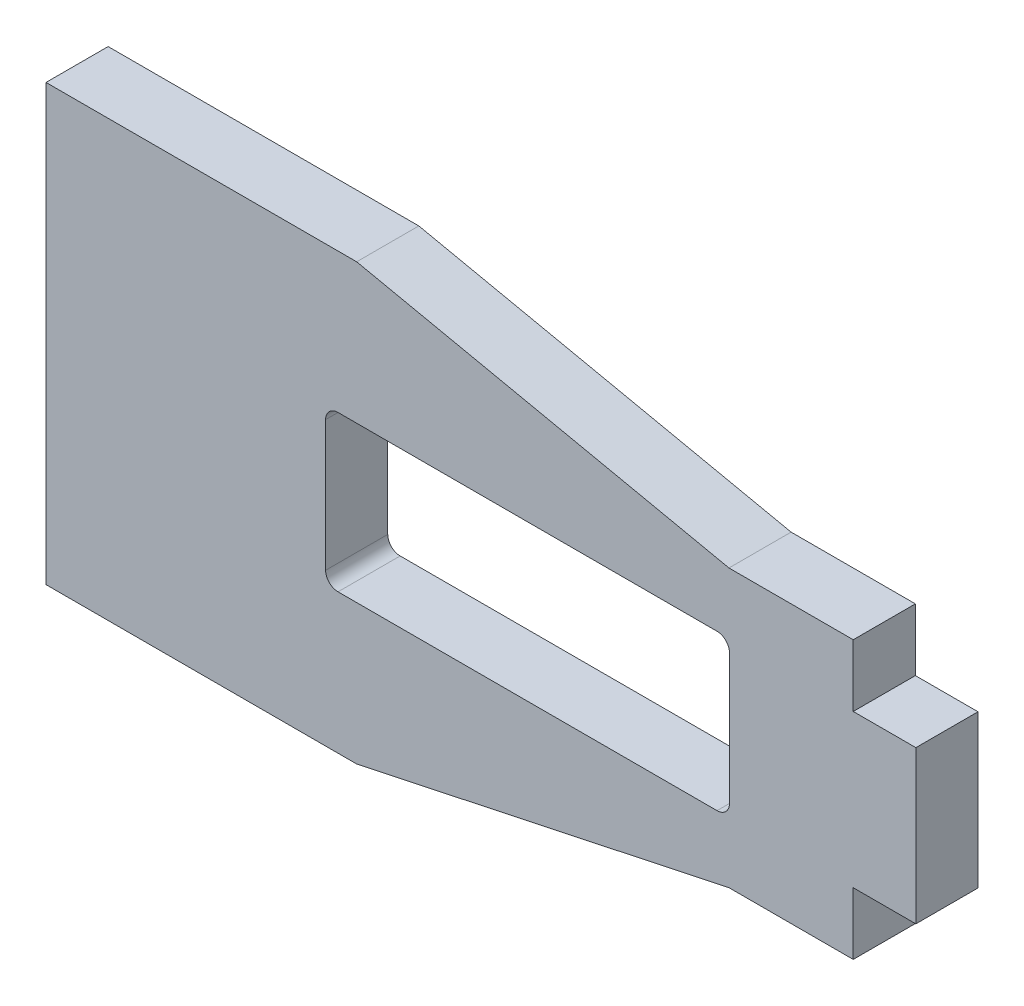
ISO-10303-21;
HEADER;
FILE_DESCRIPTION(('STEP AP214'),'2;1');
FILE_NAME('part.step','',(''),(''),'','','');
FILE_SCHEMA(('AUTOMOTIVE_DESIGN { 1 0 10303 214 1 1 1 1 }'));
ENDSEC;
DATA;
#1=APPLICATION_CONTEXT('core data for automotive mechanical design processes');
#2=APPLICATION_PROTOCOL_DEFINITION('international standard','automotive_design',2000,#1);
#3=PRODUCT_CONTEXT('',#1,'mechanical');
#4=PRODUCT('Part','Part','',(#3));
#5=PRODUCT_RELATED_PRODUCT_CATEGORY('part','',(#4));
#6=PRODUCT_DEFINITION_FORMATION('','',#4);
#7=PRODUCT_DEFINITION_CONTEXT('part definition',#1,'design');
#8=PRODUCT_DEFINITION('design','',#6,#7);
#9=PRODUCT_DEFINITION_SHAPE('','',#8);
#10=(LENGTH_UNIT() NAMED_UNIT(*) SI_UNIT(.MILLI.,.METRE.));
#11=(NAMED_UNIT(*) PLANE_ANGLE_UNIT() SI_UNIT($,.RADIAN.));
#12=(NAMED_UNIT(*) SI_UNIT($,.STERADIAN.) SOLID_ANGLE_UNIT());
#13=UNCERTAINTY_MEASURE_WITH_UNIT(LENGTH_MEASURE(1.E-05),#10,'distance_accuracy_value','');
#14=(GEOMETRIC_REPRESENTATION_CONTEXT(3) GLOBAL_UNCERTAINTY_ASSIGNED_CONTEXT((#13)) GLOBAL_UNIT_ASSIGNED_CONTEXT((#10,
#11,#12)) REPRESENTATION_CONTEXT('',''));
#15=CARTESIAN_POINT('',(0.,0.,0.));
#16=DIRECTION('',(0.,0.,1.));
#17=DIRECTION('',(1.,0.,0.));
#18=AXIS2_PLACEMENT_3D('',#15,#16,#17);
#19=CARTESIAN_POINT('',(70.,35.,10.));
#20=DIRECTION('',(-1.,0.,0.));
#21=DIRECTION('',(0.,0.,1.));
#22=AXIS2_PLACEMENT_3D('',#19,#20,#21);
#23=PLANE('',#22);
#24=DIRECTION('',(0.,1.,0.));
#25=VECTOR('',#24,1.);
#26=CARTESIAN_POINT('',(70.,35.,10.));
#27=LINE('',#26,#25);
#28=CARTESIAN_POINT('',(70.,-12.2819598667104,10.));
#29=VERTEX_POINT('',#28);
#30=CARTESIAN_POINT('',(70.,12.2819598667104,10.));
#31=VERTEX_POINT('',#30);
#32=EDGE_CURVE('E350',#29,#31,#27,.T.);
#33=ORIENTED_EDGE('',*,*,#32,.F.);
#34=DIRECTION('',(0.,0.,1.));
#35=VECTOR('',#34,1.);
#36=CARTESIAN_POINT('',(70.,-12.2819598667104,0.));
#37=LINE('',#36,#35);
#38=CARTESIAN_POINT('',(70.,-12.2819598667104,0.));
#39=VERTEX_POINT('',#38);
#40=EDGE_CURVE('E390',#39,#29,#37,.T.);
#41=ORIENTED_EDGE('',*,*,#40,.F.);
#42=DIRECTION('',(0.,1.,0.));
#43=VECTOR('',#42,1.);
#44=CARTESIAN_POINT('',(70.,35.,0.));
#45=LINE('',#44,#43);
#46=CARTESIAN_POINT('',(70.,12.2819598667104,0.));
#47=VERTEX_POINT('',#46);
#48=EDGE_CURVE('E264',#39,#47,#45,.T.);
#49=ORIENTED_EDGE('',*,*,#48,.T.);
#50=DIRECTION('',(0.,0.,1.));
#51=VECTOR('',#50,1.);
#52=CARTESIAN_POINT('',(70.,12.2819598667104,0.));
#53=LINE('',#52,#51);
#54=EDGE_CURVE('E343',#47,#31,#53,.T.);
#55=ORIENTED_EDGE('',*,*,#54,.T.);
#56=EDGE_LOOP('',(#33,#41,#49,#55));
#57=FACE_BOUND('',#56,.T.);
#58=ADVANCED_FACE('F99',(#57),#23,.F.);
#59=CARTESIAN_POINT('',(0.,0.,10.));
#60=DIRECTION('',(0.,0.,1.));
#61=DIRECTION('',(1.,0.,0.));
#62=AXIS2_PLACEMENT_3D('',#59,#60,#61);
#63=PLANE('',#62);
#64=DIRECTION('',(-1.,0.,0.));
#65=VECTOR('',#64,1.);
#66=CARTESIAN_POINT('',(0.,-12.2819598667105,10.));
#67=LINE('',#66,#65);
#68=CARTESIAN_POINT('',(59.920279213357,-12.2819598667104,10.));
#69=VERTEX_POINT('',#68);
#70=EDGE_CURVE('E384',#29,#69,#67,.T.);
#71=ORIENTED_EDGE('',*,*,#70,.F.);
#72=ORIENTED_EDGE('',*,*,#32,.T.);
#73=DIRECTION('',(-1.,0.,0.));
#74=VECTOR('',#73,1.);
#75=CARTESIAN_POINT('',(0.,12.2819598667105,10.));
#76=LINE('',#75,#74);
#77=CARTESIAN_POINT('',(59.920279213357,12.2819598667104,10.));
#78=VERTEX_POINT('',#77);
#79=EDGE_CURVE('E247',#31,#78,#76,.T.);
#80=ORIENTED_EDGE('',*,*,#79,.T.);
#81=DIRECTION('',(0.,1.,0.));
#82=VECTOR('',#81,1.);
#83=CARTESIAN_POINT('',(59.920279213357,0.,10.));
#84=LINE('',#83,#82);
#85=CARTESIAN_POINT('',(59.920279213357,22.2819598667104,10.));
#86=VERTEX_POINT('',#85);
#87=EDGE_CURVE('E673',#78,#86,#84,.T.);
#88=ORIENTED_EDGE('',*,*,#87,.T.);
#89=DIRECTION('',(-1.,0.,0.));
#90=VECTOR('',#89,1.);
#91=CARTESIAN_POINT('',(0.,22.2819598667105,10.));
#92=LINE('',#91,#90);
#93=CARTESIAN_POINT('',(39.920279213357,22.2819598667104,10.));
#94=VERTEX_POINT('',#93);
#95=EDGE_CURVE('E684',#86,#94,#92,.T.);
#96=ORIENTED_EDGE('',*,*,#95,.T.);
#97=DIRECTION('',(0.978208674738942,-0.207624152413639,0.));
#98=VECTOR('',#97,1.);
#99=CARTESIAN_POINT('',(6.24633537086233,29.4292324571813,10.));
#100=LINE('',#99,#98);
#101=CARTESIAN_POINT('',(-20.,35.,10.));
#102=VERTEX_POINT('',#101);
#103=EDGE_CURVE('E389',#102,#94,#100,.T.);
#104=ORIENTED_EDGE('',*,*,#103,.F.);
#105=DIRECTION('',(-1.,0.,0.));
#106=VECTOR('',#105,1.);
#107=CARTESIAN_POINT('',(-70.,35.,10.));
#108=LINE('',#107,#106);
#109=CARTESIAN_POINT('',(-70.,35.,10.));
#110=VERTEX_POINT('',#109);
#111=EDGE_CURVE('E255',#102,#110,#108,.T.);
#112=ORIENTED_EDGE('',*,*,#111,.T.);
#113=DIRECTION('',(0.,-1.,0.));
#114=VECTOR('',#113,1.);
#115=CARTESIAN_POINT('',(-70.,35.,10.));
#116=LINE('',#115,#114);
#117=CARTESIAN_POINT('',(-70.,-35.,10.));
#118=VERTEX_POINT('',#117);
#119=EDGE_CURVE('E263',#110,#118,#116,.T.);
#120=ORIENTED_EDGE('',*,*,#119,.T.);
#121=DIRECTION('',(1.,0.,0.));
#122=VECTOR('',#121,1.);
#123=CARTESIAN_POINT('',(-70.,-35.,10.));
#124=LINE('',#123,#122);
#125=CARTESIAN_POINT('',(-20.,-35.,10.));
#126=VERTEX_POINT('',#125);
#127=EDGE_CURVE('E267',#118,#126,#124,.T.);
#128=ORIENTED_EDGE('',*,*,#127,.T.);
#129=DIRECTION('',(-0.978208674738942,-0.207624152413639,0.));
#130=VECTOR('',#129,1.);
#131=CARTESIAN_POINT('',(6.24633537086233,-29.4292324571813,10.));
#132=LINE('',#131,#130);
#133=CARTESIAN_POINT('',(39.920279213357,-22.2819598667104,10.));
#134=VERTEX_POINT('',#133);
#135=EDGE_CURVE('E382',#134,#126,#132,.T.);
#136=ORIENTED_EDGE('',*,*,#135,.F.);
#137=DIRECTION('',(-1.,0.,0.));
#138=VECTOR('',#137,1.);
#139=CARTESIAN_POINT('',(0.,-22.2819598667105,10.));
#140=LINE('',#139,#138);
#141=CARTESIAN_POINT('',(59.920279213357,-22.2819598667104,10.));
#142=VERTEX_POINT('',#141);
#143=EDGE_CURVE('E379',#142,#134,#140,.T.);
#144=ORIENTED_EDGE('',*,*,#143,.F.);
#145=DIRECTION('',(0.,-1.,0.));
#146=VECTOR('',#145,1.);
#147=CARTESIAN_POINT('',(59.920279213357,0.,10.));
#148=LINE('',#147,#146);
#149=EDGE_CURVE('E376',#69,#142,#148,.T.);
#150=ORIENTED_EDGE('',*,*,#149,.F.);
#151=EDGE_LOOP('',(#71,#72,#80,#88,#96,#104,#112,#120,#128,#136,#144,#150));
#152=FACE_BOUND('',#151,.T.);
#153=DIRECTION('',(1.,0.,0.));
#154=VECTOR('',#153,1.);
#155=CARTESIAN_POINT('',(0.,-12.5,10.));
#156=LINE('',#155,#154);
#157=CARTESIAN_POINT('',(-23.,-12.5,10.));
#158=VERTEX_POINT('',#157);
#159=CARTESIAN_POINT('',(38.,-12.5,10.));
#160=VERTEX_POINT('',#159);
#161=EDGE_CURVE('E315',#158,#160,#156,.T.);
#162=ORIENTED_EDGE('',*,*,#161,.F.);
#163=CARTESIAN_POINT('',(-23.,-10.5,10.));
#164=DIRECTION('',(0.,0.,1.));
#165=DIRECTION('',(1.,0.,0.));
#166=AXIS2_PLACEMENT_3D('',#163,#164,#165);
#167=CIRCLE('',#166,2.);
#168=CARTESIAN_POINT('',(-25.,-10.5,10.));
#169=VERTEX_POINT('',#168);
#170=EDGE_CURVE('E107',#158,#169,#167,.F.);
#171=ORIENTED_EDGE('',*,*,#170,.T.);
#172=DIRECTION('',(0.,-1.,0.));
#173=VECTOR('',#172,1.);
#174=CARTESIAN_POINT('',(-25.,0.,10.));
#175=LINE('',#174,#173);
#176=CARTESIAN_POINT('',(-25.,10.5,10.));
#177=VERTEX_POINT('',#176);
#178=EDGE_CURVE('E314',#177,#169,#175,.T.);
#179=ORIENTED_EDGE('',*,*,#178,.F.);
#180=CARTESIAN_POINT('',(-23.,10.5,10.));
#181=DIRECTION('',(0.,0.,1.));
#182=DIRECTION('',(1.,0.,0.));
#183=AXIS2_PLACEMENT_3D('',#180,#181,#182);
#184=CIRCLE('',#183,2.);
#185=CARTESIAN_POINT('',(-23.,12.5,10.));
#186=VERTEX_POINT('',#185);
#187=EDGE_CURVE('E298',#177,#186,#184,.F.);
#188=ORIENTED_EDGE('',*,*,#187,.T.);
#189=DIRECTION('',(1.,0.,0.));
#190=VECTOR('',#189,1.);
#191=CARTESIAN_POINT('',(0.,12.5,10.));
#192=LINE('',#191,#190);
#193=CARTESIAN_POINT('',(38.,12.5,10.));
#194=VERTEX_POINT('',#193);
#195=EDGE_CURVE('E324',#186,#194,#192,.T.);
#196=ORIENTED_EDGE('',*,*,#195,.T.);
#197=CARTESIAN_POINT('',(38.,10.5,10.));
#198=DIRECTION('',(0.,0.,1.));
#199=DIRECTION('',(1.,0.,0.));
#200=AXIS2_PLACEMENT_3D('',#197,#198,#199);
#201=CIRCLE('',#200,2.);
#202=CARTESIAN_POINT('',(40.,10.5,10.));
#203=VERTEX_POINT('',#202);
#204=EDGE_CURVE('E302',#194,#203,#201,.F.);
#205=ORIENTED_EDGE('',*,*,#204,.T.);
#206=DIRECTION('',(0.,-1.,0.));
#207=VECTOR('',#206,1.);
#208=CARTESIAN_POINT('',(40.,0.,10.));
#209=LINE('',#208,#207);
#210=CARTESIAN_POINT('',(40.,-10.5,10.));
#211=VERTEX_POINT('',#210);
#212=EDGE_CURVE('E342',#203,#211,#209,.T.);
#213=ORIENTED_EDGE('',*,*,#212,.T.);
#214=CARTESIAN_POINT('',(38.,-10.5,10.));
#215=DIRECTION('',(0.,0.,1.));
#216=DIRECTION('',(1.,0.,0.));
#217=AXIS2_PLACEMENT_3D('',#214,#215,#216);
#218=CIRCLE('',#217,2.);
#219=EDGE_CURVE('E306',#211,#160,#218,.F.);
#220=ORIENTED_EDGE('',*,*,#219,.T.);
#221=EDGE_LOOP('',(#162,#171,#179,#188,#196,#205,#213,#220));
#222=FACE_BOUND('',#221,.T.);
#223=ADVANCED_FACE('F313',(#152,#222),#63,.T.);
#224=CARTESIAN_POINT('',(0.,0.,0.));
#225=DIRECTION('',(0.,0.,1.));
#226=DIRECTION('',(1.,0.,0.));
#227=AXIS2_PLACEMENT_3D('',#224,#225,#226);
#228=PLANE('',#227);
#229=ORIENTED_EDGE('',*,*,#48,.F.);
#230=DIRECTION('',(-1.,0.,0.));
#231=VECTOR('',#230,1.);
#232=CARTESIAN_POINT('',(0.,-12.2819598667105,0.));
#233=LINE('',#232,#231);
#234=CARTESIAN_POINT('',(59.920279213357,-12.2819598667104,0.));
#235=VERTEX_POINT('',#234);
#236=EDGE_CURVE('E368',#39,#235,#233,.T.);
#237=ORIENTED_EDGE('',*,*,#236,.T.);
#238=DIRECTION('',(0.,-1.,0.));
#239=VECTOR('',#238,1.);
#240=CARTESIAN_POINT('',(59.920279213357,0.,0.));
#241=LINE('',#240,#239);
#242=CARTESIAN_POINT('',(59.920279213357,-22.2819598667104,0.));
#243=VERTEX_POINT('',#242);
#244=EDGE_CURVE('E372',#235,#243,#241,.T.);
#245=ORIENTED_EDGE('',*,*,#244,.T.);
#246=DIRECTION('',(-1.,0.,0.));
#247=VECTOR('',#246,1.);
#248=CARTESIAN_POINT('',(0.,-22.2819598667105,0.));
#249=LINE('',#248,#247);
#250=CARTESIAN_POINT('',(39.920279213357,-22.2819598667104,0.));
#251=VERTEX_POINT('',#250);
#252=EDGE_CURVE('E365',#243,#251,#249,.T.);
#253=ORIENTED_EDGE('',*,*,#252,.T.);
#254=DIRECTION('',(-0.978208674738942,-0.207624152413639,0.));
#255=VECTOR('',#254,1.);
#256=CARTESIAN_POINT('',(6.24633537086233,-29.4292324571813,0.));
#257=LINE('',#256,#255);
#258=CARTESIAN_POINT('',(-20.,-35.,0.));
#259=VERTEX_POINT('',#258);
#260=EDGE_CURVE('E362',#251,#259,#257,.T.);
#261=ORIENTED_EDGE('',*,*,#260,.T.);
#262=DIRECTION('',(1.,0.,0.));
#263=VECTOR('',#262,1.);
#264=CARTESIAN_POINT('',(-70.,-35.,0.));
#265=LINE('',#264,#263);
#266=CARTESIAN_POINT('',(-70.,-35.,0.));
#267=VERTEX_POINT('',#266);
#268=EDGE_CURVE('E270',#267,#259,#265,.T.);
#269=ORIENTED_EDGE('',*,*,#268,.F.);
#270=DIRECTION('',(0.,-1.,0.));
#271=VECTOR('',#270,1.);
#272=CARTESIAN_POINT('',(-70.,35.,0.));
#273=LINE('',#272,#271);
#274=CARTESIAN_POINT('',(-70.,35.,0.));
#275=VERTEX_POINT('',#274);
#276=EDGE_CURVE('E262',#275,#267,#273,.T.);
#277=ORIENTED_EDGE('',*,*,#276,.F.);
#278=DIRECTION('',(-1.,0.,0.));
#279=VECTOR('',#278,1.);
#280=CARTESIAN_POINT('',(-70.,35.,0.));
#281=LINE('',#280,#279);
#282=CARTESIAN_POINT('',(-20.,35.,0.));
#283=VERTEX_POINT('',#282);
#284=EDGE_CURVE('E253',#283,#275,#281,.T.);
#285=ORIENTED_EDGE('',*,*,#284,.F.);
#286=DIRECTION('',(0.978208674738942,-0.207624152413639,0.));
#287=VECTOR('',#286,1.);
#288=CARTESIAN_POINT('',(6.24633537086233,29.4292324571813,0.));
#289=LINE('',#288,#287);
#290=CARTESIAN_POINT('',(39.920279213357,22.2819598667104,0.));
#291=VERTEX_POINT('',#290);
#292=EDGE_CURVE('E235',#283,#291,#289,.T.);
#293=ORIENTED_EDGE('',*,*,#292,.T.);
#294=DIRECTION('',(-1.,0.,0.));
#295=VECTOR('',#294,1.);
#296=CARTESIAN_POINT('',(0.,22.2819598667105,0.));
#297=LINE('',#296,#295);
#298=CARTESIAN_POINT('',(59.920279213357,22.2819598667104,0.));
#299=VERTEX_POINT('',#298);
#300=EDGE_CURVE('E246',#299,#291,#297,.T.);
#301=ORIENTED_EDGE('',*,*,#300,.F.);
#302=DIRECTION('',(0.,1.,0.));
#303=VECTOR('',#302,1.);
#304=CARTESIAN_POINT('',(59.920279213357,0.,0.));
#305=LINE('',#304,#303);
#306=CARTESIAN_POINT('',(59.920279213357,12.2819598667104,0.));
#307=VERTEX_POINT('',#306);
#308=EDGE_CURVE('E678',#307,#299,#305,.T.);
#309=ORIENTED_EDGE('',*,*,#308,.F.);
#310=DIRECTION('',(-1.,0.,0.));
#311=VECTOR('',#310,1.);
#312=CARTESIAN_POINT('',(0.,12.2819598667105,0.));
#313=LINE('',#312,#311);
#314=EDGE_CURVE('E256',#47,#307,#313,.T.);
#315=ORIENTED_EDGE('',*,*,#314,.F.);
#316=EDGE_LOOP('',(#229,#237,#245,#253,#261,#269,#277,#285,#293,#301,#309,#315));
#317=FACE_BOUND('',#316,.T.);
#318=DIRECTION('',(1.,0.,0.));
#319=VECTOR('',#318,1.);
#320=CARTESIAN_POINT('',(0.,12.5,0.));
#321=LINE('',#320,#319);
#322=CARTESIAN_POINT('',(-23.,12.5,0.));
#323=VERTEX_POINT('',#322);
#324=CARTESIAN_POINT('',(38.,12.5,0.));
#325=VERTEX_POINT('',#324);
#326=EDGE_CURVE('E331',#323,#325,#321,.T.);
#327=ORIENTED_EDGE('',*,*,#326,.F.);
#328=CARTESIAN_POINT('',(-23.,10.5,0.));
#329=DIRECTION('',(0.,0.,1.));
#330=DIRECTION('',(1.,0.,0.));
#331=AXIS2_PLACEMENT_3D('',#328,#329,#330);
#332=CIRCLE('',#331,2.);
#333=CARTESIAN_POINT('',(-25.,10.5,0.));
#334=VERTEX_POINT('',#333);
#335=EDGE_CURVE('E300',#323,#334,#332,.T.);
#336=ORIENTED_EDGE('',*,*,#335,.T.);
#337=DIRECTION('',(0.,-1.,0.));
#338=VECTOR('',#337,1.);
#339=CARTESIAN_POINT('',(-25.,0.,0.));
#340=LINE('',#339,#338);
#341=CARTESIAN_POINT('',(-25.,-10.5,0.));
#342=VERTEX_POINT('',#341);
#343=EDGE_CURVE('E339',#334,#342,#340,.T.);
#344=ORIENTED_EDGE('',*,*,#343,.T.);
#345=CARTESIAN_POINT('',(-23.,-10.5,0.));
#346=DIRECTION('',(0.,0.,1.));
#347=DIRECTION('',(1.,0.,0.));
#348=AXIS2_PLACEMENT_3D('',#345,#346,#347);
#349=CIRCLE('',#348,2.);
#350=CARTESIAN_POINT('',(-23.,-12.5,0.));
#351=VERTEX_POINT('',#350);
#352=EDGE_CURVE('E12',#342,#351,#349,.T.);
#353=ORIENTED_EDGE('',*,*,#352,.T.);
#354=DIRECTION('',(1.,0.,0.));
#355=VECTOR('',#354,1.);
#356=CARTESIAN_POINT('',(0.,-12.5,0.));
#357=LINE('',#356,#355);
#358=CARTESIAN_POINT('',(38.,-12.5,0.));
#359=VERTEX_POINT('',#358);
#360=EDGE_CURVE('E323',#351,#359,#357,.T.);
#361=ORIENTED_EDGE('',*,*,#360,.T.);
#362=CARTESIAN_POINT('',(38.,-10.5,0.));
#363=DIRECTION('',(0.,0.,1.));
#364=DIRECTION('',(1.,0.,0.));
#365=AXIS2_PLACEMENT_3D('',#362,#363,#364);
#366=CIRCLE('',#365,2.);
#367=CARTESIAN_POINT('',(40.,-10.5,0.));
#368=VERTEX_POINT('',#367);
#369=EDGE_CURVE('E308',#359,#368,#366,.T.);
#370=ORIENTED_EDGE('',*,*,#369,.T.);
#371=DIRECTION('',(0.,-1.,0.));
#372=VECTOR('',#371,1.);
#373=CARTESIAN_POINT('',(40.,0.,0.));
#374=LINE('',#373,#372);
#375=CARTESIAN_POINT('',(40.,10.5,0.));
#376=VERTEX_POINT('',#375);
#377=EDGE_CURVE('E328',#376,#368,#374,.T.);
#378=ORIENTED_EDGE('',*,*,#377,.F.);
#379=CARTESIAN_POINT('',(38.,10.5,0.));
#380=DIRECTION('',(0.,0.,1.));
#381=DIRECTION('',(1.,0.,0.));
#382=AXIS2_PLACEMENT_3D('',#379,#380,#381);
#383=CIRCLE('',#382,2.);
#384=EDGE_CURVE('E304',#376,#325,#383,.T.);
#385=ORIENTED_EDGE('',*,*,#384,.T.);
#386=EDGE_LOOP('',(#327,#336,#344,#353,#361,#370,#378,#385));
#387=FACE_BOUND('',#386,.T.);
#388=ADVANCED_FACE('F260',(#317,#387),#228,.F.);
#389=CARTESIAN_POINT('',(-70.,35.,10.));
#390=DIRECTION('',(1.,0.,0.));
#391=DIRECTION('',(0.,0.,-1.));
#392=AXIS2_PLACEMENT_3D('',#389,#390,#391);
#393=PLANE('',#392);
#394=ORIENTED_EDGE('',*,*,#276,.T.);
#395=DIRECTION('',(0.,0.,-1.));
#396=VECTOR('',#395,1.);
#397=CARTESIAN_POINT('',(-70.,-35.,10.));
#398=LINE('',#397,#396);
#399=EDGE_CURVE('E276',#118,#267,#398,.T.);
#400=ORIENTED_EDGE('',*,*,#399,.F.);
#401=ORIENTED_EDGE('',*,*,#119,.F.);
#402=DIRECTION('',(0.,0.,-1.));
#403=VECTOR('',#402,1.);
#404=CARTESIAN_POINT('',(-70.,35.,10.));
#405=LINE('',#404,#403);
#406=EDGE_CURVE('E274',#110,#275,#405,.T.);
#407=ORIENTED_EDGE('',*,*,#406,.T.);
#408=EDGE_LOOP('',(#394,#400,#401,#407));
#409=FACE_BOUND('',#408,.T.);
#410=ADVANCED_FACE('F428',(#409),#393,.F.);
#411=CARTESIAN_POINT('',(-70.,-35.,10.));
#412=DIRECTION('',(0.,1.,0.));
#413=DIRECTION('',(0.,0.,1.));
#414=AXIS2_PLACEMENT_3D('',#411,#412,#413);
#415=PLANE('',#414);
#416=ORIENTED_EDGE('',*,*,#268,.T.);
#417=DIRECTION('',(0.,0.,1.));
#418=VECTOR('',#417,1.);
#419=CARTESIAN_POINT('',(-20.,-35.,0.));
#420=LINE('',#419,#418);
#421=EDGE_CURVE('E358',#259,#126,#420,.T.);
#422=ORIENTED_EDGE('',*,*,#421,.T.);
#423=ORIENTED_EDGE('',*,*,#127,.F.);
#424=ORIENTED_EDGE('',*,*,#399,.T.);
#425=EDGE_LOOP('',(#416,#422,#423,#424));
#426=FACE_BOUND('',#425,.T.);
#427=ADVANCED_FACE('F357',(#426),#415,.F.);
#428=CARTESIAN_POINT('',(-70.,35.,10.));
#429=DIRECTION('',(0.,-1.,0.));
#430=DIRECTION('',(0.,0.,-1.));
#431=AXIS2_PLACEMENT_3D('',#428,#429,#430);
#432=PLANE('',#431);
#433=ORIENTED_EDGE('',*,*,#111,.F.);
#434=DIRECTION('',(0.,0.,1.));
#435=VECTOR('',#434,1.);
#436=CARTESIAN_POINT('',(-20.,35.,0.));
#437=LINE('',#436,#435);
#438=EDGE_CURVE('E239',#283,#102,#437,.T.);
#439=ORIENTED_EDGE('',*,*,#438,.F.);
#440=ORIENTED_EDGE('',*,*,#284,.T.);
#441=ORIENTED_EDGE('',*,*,#406,.F.);
#442=EDGE_LOOP('',(#433,#439,#440,#441));
#443=FACE_BOUND('',#442,.T.);
#444=ADVANCED_FACE('F251',(#443),#432,.F.);
#445=CARTESIAN_POINT('',(0.,-12.5,0.));
#446=DIRECTION('',(0.,-1.,0.));
#447=DIRECTION('',(0.,0.,-1.));
#448=AXIS2_PLACEMENT_3D('',#445,#446,#447);
#449=PLANE('',#448);
#450=ORIENTED_EDGE('',*,*,#161,.T.);
#451=DIRECTION('',(0.,0.,1.));
#452=VECTOR('',#451,1.);
#453=CARTESIAN_POINT('',(38.,-12.5,0.));
#454=LINE('',#453,#452);
#455=EDGE_CURVE('E114',#160,#359,#454,.F.);
#456=ORIENTED_EDGE('',*,*,#455,.T.);
#457=ORIENTED_EDGE('',*,*,#360,.F.);
#458=DIRECTION('',(0.,0.,1.));
#459=VECTOR('',#458,1.);
#460=CARTESIAN_POINT('',(-23.,-12.5,10.));
#461=LINE('',#460,#459);
#462=EDGE_CURVE('E294',#351,#158,#461,.T.);
#463=ORIENTED_EDGE('',*,*,#462,.T.);
#464=EDGE_LOOP('',(#450,#456,#457,#463));
#465=FACE_BOUND('',#464,.T.);
#466=ADVANCED_FACE('F326',(#465),#449,.F.);
#467=CARTESIAN_POINT('',(-25.,0.,0.));
#468=DIRECTION('',(-1.,0.,0.));
#469=DIRECTION('',(0.,0.,1.));
#470=AXIS2_PLACEMENT_3D('',#467,#468,#469);
#471=PLANE('',#470);
#472=ORIENTED_EDGE('',*,*,#343,.F.);
#473=DIRECTION('',(0.,0.,1.));
#474=VECTOR('',#473,1.);
#475=CARTESIAN_POINT('',(-25.,10.5,0.));
#476=LINE('',#475,#474);
#477=EDGE_CURVE('E281',#334,#177,#476,.T.);
#478=ORIENTED_EDGE('',*,*,#477,.T.);
#479=ORIENTED_EDGE('',*,*,#178,.T.);
#480=DIRECTION('',(0.,0.,1.));
#481=VECTOR('',#480,1.);
#482=CARTESIAN_POINT('',(-25.,-10.5,0.));
#483=LINE('',#482,#481);
#484=EDGE_CURVE('E279',#169,#342,#483,.F.);
#485=ORIENTED_EDGE('',*,*,#484,.T.);
#486=EDGE_LOOP('',(#472,#478,#479,#485));
#487=FACE_BOUND('',#486,.T.);
#488=ADVANCED_FACE('F321',(#487),#471,.F.);
#489=CARTESIAN_POINT('',(0.,12.5,0.));
#490=DIRECTION('',(0.,-1.,0.));
#491=DIRECTION('',(0.,0.,-1.));
#492=AXIS2_PLACEMENT_3D('',#489,#490,#491);
#493=PLANE('',#492);
#494=ORIENTED_EDGE('',*,*,#195,.F.);
#495=DIRECTION('',(0.,0.,1.));
#496=VECTOR('',#495,1.);
#497=CARTESIAN_POINT('',(-23.,12.5,0.));
#498=LINE('',#497,#496);
#499=EDGE_CURVE('E287',#186,#323,#498,.F.);
#500=ORIENTED_EDGE('',*,*,#499,.T.);
#501=ORIENTED_EDGE('',*,*,#326,.T.);
#502=DIRECTION('',(0.,0.,1.));
#503=VECTOR('',#502,1.);
#504=CARTESIAN_POINT('',(38.,12.5,10.));
#505=LINE('',#504,#503);
#506=EDGE_CURVE('E284',#325,#194,#505,.T.);
#507=ORIENTED_EDGE('',*,*,#506,.T.);
#508=EDGE_LOOP('',(#494,#500,#501,#507));
#509=FACE_BOUND('',#508,.T.);
#510=ADVANCED_FACE('F456',(#509),#493,.T.);
#511=CARTESIAN_POINT('',(40.,0.,0.));
#512=DIRECTION('',(-1.,0.,0.));
#513=DIRECTION('',(0.,0.,1.));
#514=AXIS2_PLACEMENT_3D('',#511,#512,#513);
#515=PLANE('',#514);
#516=ORIENTED_EDGE('',*,*,#212,.F.);
#517=DIRECTION('',(0.,0.,1.));
#518=VECTOR('',#517,1.);
#519=CARTESIAN_POINT('',(40.,10.5,0.));
#520=LINE('',#519,#518);
#521=EDGE_CURVE('E292',#203,#376,#520,.F.);
#522=ORIENTED_EDGE('',*,*,#521,.T.);
#523=ORIENTED_EDGE('',*,*,#377,.T.);
#524=DIRECTION('',(0.,0.,1.));
#525=VECTOR('',#524,1.);
#526=CARTESIAN_POINT('',(40.,-10.5,0.));
#527=LINE('',#526,#525);
#528=EDGE_CURVE('E289',#368,#211,#527,.T.);
#529=ORIENTED_EDGE('',*,*,#528,.T.);
#530=EDGE_LOOP('',(#516,#522,#523,#529));
#531=FACE_BOUND('',#530,.T.);
#532=ADVANCED_FACE('F450',(#531),#515,.T.);
#533=CARTESIAN_POINT('',(0.,12.2819598667105,0.));
#534=DIRECTION('',(0.,1.,0.));
#535=DIRECTION('',(-1.,0.,0.));
#536=AXIS2_PLACEMENT_3D('',#533,#534,#535);
#537=PLANE('',#536);
#538=ORIENTED_EDGE('',*,*,#79,.F.);
#539=ORIENTED_EDGE('',*,*,#54,.F.);
#540=ORIENTED_EDGE('',*,*,#314,.T.);
#541=DIRECTION('',(0.,0.,1.));
#542=VECTOR('',#541,1.);
#543=CARTESIAN_POINT('',(59.920279213357,12.2819598667104,0.));
#544=LINE('',#543,#542);
#545=EDGE_CURVE('E670',#307,#78,#544,.T.);
#546=ORIENTED_EDGE('',*,*,#545,.T.);
#547=EDGE_LOOP('',(#538,#539,#540,#546));
#548=FACE_BOUND('',#547,.T.);
#549=ADVANCED_FACE('F464',(#548),#537,.T.);
#550=CARTESIAN_POINT('',(59.920279213357,0.,0.));
#551=DIRECTION('',(1.,0.,0.));
#552=DIRECTION('',(0.,0.,-1.));
#553=AXIS2_PLACEMENT_3D('',#550,#551,#552);
#554=PLANE('',#553);
#555=ORIENTED_EDGE('',*,*,#87,.F.);
#556=ORIENTED_EDGE('',*,*,#545,.F.);
#557=ORIENTED_EDGE('',*,*,#308,.T.);
#558=DIRECTION('',(0.,0.,1.));
#559=VECTOR('',#558,1.);
#560=CARTESIAN_POINT('',(59.920279213357,22.2819598667104,0.));
#561=LINE('',#560,#559);
#562=EDGE_CURVE('E689',#299,#86,#561,.T.);
#563=ORIENTED_EDGE('',*,*,#562,.T.);
#564=EDGE_LOOP('',(#555,#556,#557,#563));
#565=FACE_BOUND('',#564,.T.);
#566=ADVANCED_FACE('F585',(#565),#554,.T.);
#567=CARTESIAN_POINT('',(0.,22.2819598667105,0.));
#568=DIRECTION('',(0.,1.,0.));
#569=DIRECTION('',(-1.,0.,0.));
#570=AXIS2_PLACEMENT_3D('',#567,#568,#569);
#571=PLANE('',#570);
#572=ORIENTED_EDGE('',*,*,#95,.F.);
#573=ORIENTED_EDGE('',*,*,#562,.F.);
#574=ORIENTED_EDGE('',*,*,#300,.T.);
#575=DIRECTION('',(0.,0.,1.));
#576=VECTOR('',#575,1.);
#577=CARTESIAN_POINT('',(39.920279213357,22.2819598667104,0.));
#578=LINE('',#577,#576);
#579=EDGE_CURVE('E241',#291,#94,#578,.T.);
#580=ORIENTED_EDGE('',*,*,#579,.T.);
#581=EDGE_LOOP('',(#572,#573,#574,#580));
#582=FACE_BOUND('',#581,.T.);
#583=ADVANCED_FACE('F575',(#582),#571,.T.);
#584=CARTESIAN_POINT('',(6.24633537086233,29.4292324571813,0.));
#585=DIRECTION('',(-0.207624152413639,-0.978208674738942,0.));
#586=DIRECTION('',(0.978208674738942,-0.207624152413639,0.));
#587=AXIS2_PLACEMENT_3D('',#584,#585,#586);
#588=PLANE('',#587);
#589=ORIENTED_EDGE('',*,*,#103,.T.);
#590=ORIENTED_EDGE('',*,*,#579,.F.);
#591=ORIENTED_EDGE('',*,*,#292,.F.);
#592=ORIENTED_EDGE('',*,*,#438,.T.);
#593=EDGE_LOOP('',(#589,#590,#591,#592));
#594=FACE_BOUND('',#593,.T.);
#595=ADVANCED_FACE('F238',(#594),#588,.F.);
#596=CARTESIAN_POINT('',(59.920279213357,0.,0.));
#597=DIRECTION('',(-1.,0.,0.));
#598=DIRECTION('',(0.,0.,1.));
#599=AXIS2_PLACEMENT_3D('',#596,#597,#598);
#600=PLANE('',#599);
#601=ORIENTED_EDGE('',*,*,#149,.T.);
#602=DIRECTION('',(0.,0.,1.));
#603=VECTOR('',#602,1.);
#604=CARTESIAN_POINT('',(59.920279213357,-22.2819598667104,0.));
#605=LINE('',#604,#603);
#606=EDGE_CURVE('E334',#243,#142,#605,.T.);
#607=ORIENTED_EDGE('',*,*,#606,.F.);
#608=ORIENTED_EDGE('',*,*,#244,.F.);
#609=DIRECTION('',(0.,0.,1.));
#610=VECTOR('',#609,1.);
#611=CARTESIAN_POINT('',(59.920279213357,-12.2819598667104,0.));
#612=LINE('',#611,#610);
#613=EDGE_CURVE('E387',#235,#69,#612,.T.);
#614=ORIENTED_EDGE('',*,*,#613,.T.);
#615=EDGE_LOOP('',(#601,#607,#608,#614));
#616=FACE_BOUND('',#615,.T.);
#617=ADVANCED_FACE('F400',(#616),#600,.F.);
#618=CARTESIAN_POINT('',(0.,-12.2819598667105,0.));
#619=DIRECTION('',(0.,1.,0.));
#620=DIRECTION('',(-1.,0.,0.));
#621=AXIS2_PLACEMENT_3D('',#618,#619,#620);
#622=PLANE('',#621);
#623=ORIENTED_EDGE('',*,*,#70,.T.);
#624=ORIENTED_EDGE('',*,*,#613,.F.);
#625=ORIENTED_EDGE('',*,*,#236,.F.);
#626=ORIENTED_EDGE('',*,*,#40,.T.);
#627=EDGE_LOOP('',(#623,#624,#625,#626));
#628=FACE_BOUND('',#627,.T.);
#629=ADVANCED_FACE('F405',(#628),#622,.F.);
#630=CARTESIAN_POINT('',(6.24633537086233,-29.4292324571813,0.));
#631=DIRECTION('',(-0.207624152413639,0.978208674738942,0.));
#632=DIRECTION('',(-0.978208674738942,-0.207624152413639,0.));
#633=AXIS2_PLACEMENT_3D('',#630,#631,#632);
#634=PLANE('',#633);
#635=ORIENTED_EDGE('',*,*,#135,.T.);
#636=ORIENTED_EDGE('',*,*,#421,.F.);
#637=ORIENTED_EDGE('',*,*,#260,.F.);
#638=DIRECTION('',(0.,0.,1.));
#639=VECTOR('',#638,1.);
#640=CARTESIAN_POINT('',(39.920279213357,-22.2819598667104,0.));
#641=LINE('',#640,#639);
#642=EDGE_CURVE('E392',#251,#134,#641,.T.);
#643=ORIENTED_EDGE('',*,*,#642,.T.);
#644=EDGE_LOOP('',(#635,#636,#637,#643));
#645=FACE_BOUND('',#644,.T.);
#646=ADVANCED_FACE('F403',(#645),#634,.F.);
#647=CARTESIAN_POINT('',(0.,-22.2819598667105,0.));
#648=DIRECTION('',(0.,1.,0.));
#649=DIRECTION('',(-1.,0.,0.));
#650=AXIS2_PLACEMENT_3D('',#647,#648,#649);
#651=PLANE('',#650);
#652=ORIENTED_EDGE('',*,*,#143,.T.);
#653=ORIENTED_EDGE('',*,*,#642,.F.);
#654=ORIENTED_EDGE('',*,*,#252,.F.);
#655=ORIENTED_EDGE('',*,*,#606,.T.);
#656=EDGE_LOOP('',(#652,#653,#654,#655));
#657=FACE_BOUND('',#656,.T.);
#658=ADVANCED_FACE('F394',(#657),#651,.F.);
#659=CARTESIAN_POINT('',(-23.,10.5,0.));
#660=DIRECTION('',(0.,0.,1.));
#661=DIRECTION('',(1.,0.,0.));
#662=AXIS2_PLACEMENT_3D('',#659,#660,#661);
#663=CYLINDRICAL_SURFACE('',#662,2.);
#664=ORIENTED_EDGE('',*,*,#335,.F.);
#665=ORIENTED_EDGE('',*,*,#499,.F.);
#666=ORIENTED_EDGE('',*,*,#187,.F.);
#667=ORIENTED_EDGE('',*,*,#477,.F.);
#668=EDGE_LOOP('',(#664,#665,#666,#667));
#669=FACE_BOUND('',#668,.T.);
#670=ADVANCED_FACE('F411',(#669),#663,.F.);
#671=CARTESIAN_POINT('',(38.,10.5,0.));
#672=DIRECTION('',(0.,0.,-1.));
#673=DIRECTION('',(-1.,0.,0.));
#674=AXIS2_PLACEMENT_3D('',#671,#672,#673);
#675=CYLINDRICAL_SURFACE('',#674,2.);
#676=ORIENTED_EDGE('',*,*,#384,.F.);
#677=ORIENTED_EDGE('',*,*,#521,.F.);
#678=ORIENTED_EDGE('',*,*,#204,.F.);
#679=ORIENTED_EDGE('',*,*,#506,.F.);
#680=EDGE_LOOP('',(#676,#677,#678,#679));
#681=FACE_BOUND('',#680,.T.);
#682=ADVANCED_FACE('F434',(#681),#675,.F.);
#683=CARTESIAN_POINT('',(38.,-10.5,0.));
#684=DIRECTION('',(0.,0.,1.));
#685=DIRECTION('',(1.,0.,0.));
#686=AXIS2_PLACEMENT_3D('',#683,#684,#685);
#687=CYLINDRICAL_SURFACE('',#686,2.);
#688=ORIENTED_EDGE('',*,*,#369,.F.);
#689=ORIENTED_EDGE('',*,*,#455,.F.);
#690=ORIENTED_EDGE('',*,*,#219,.F.);
#691=ORIENTED_EDGE('',*,*,#528,.F.);
#692=EDGE_LOOP('',(#688,#689,#690,#691));
#693=FACE_BOUND('',#692,.T.);
#694=ADVANCED_FACE('F437',(#693),#687,.F.);
#695=CARTESIAN_POINT('',(-23.,-10.5,0.));
#696=DIRECTION('',(0.,0.,-1.));
#697=DIRECTION('',(-1.,0.,0.));
#698=AXIS2_PLACEMENT_3D('',#695,#696,#697);
#699=CYLINDRICAL_SURFACE('',#698,2.);
#700=ORIENTED_EDGE('',*,*,#352,.F.);
#701=ORIENTED_EDGE('',*,*,#484,.F.);
#702=ORIENTED_EDGE('',*,*,#170,.F.);
#703=ORIENTED_EDGE('',*,*,#462,.F.);
#704=EDGE_LOOP('',(#700,#701,#702,#703));
#705=FACE_BOUND('',#704,.T.);
#706=ADVANCED_FACE('F101',(#705),#699,.F.);
#707=CLOSED_SHELL('',(#58,#223,#388,#410,#427,#444,#466,#488,#510,#532,#549,#566,#583,#595,#617,
#629,#646,#658,#670,#682,#694,#706));
#708=MANIFOLD_SOLID_BREP('B2',#707);
#709=ADVANCED_BREP_SHAPE_REPRESENTATION('',(#18,#708),#14);
#710=SHAPE_DEFINITION_REPRESENTATION(#9,#709);
ENDSEC;
END-ISO-10303-21;
